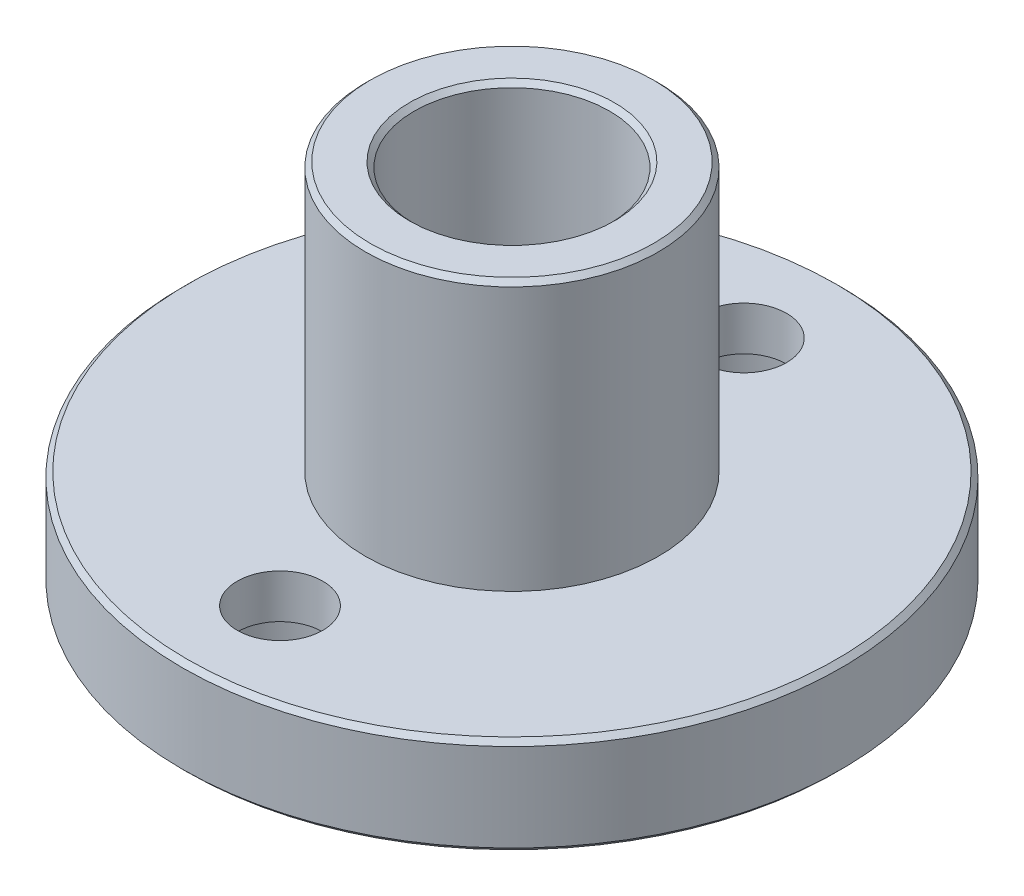
ISO-10303-21;
HEADER;
FILE_DESCRIPTION(('STEP AP214'),'2;1');
FILE_NAME('part.step','',(''),(''),'','','');
FILE_SCHEMA(('AUTOMOTIVE_DESIGN { 1 0 10303 214 1 1 1 1 }'));
ENDSEC;
DATA;
#1=APPLICATION_CONTEXT('core data for automotive mechanical design processes');
#2=APPLICATION_PROTOCOL_DEFINITION('international standard','automotive_design',2000,#1);
#3=PRODUCT_CONTEXT('',#1,'mechanical');
#4=PRODUCT('Part','Part','',(#3));
#5=PRODUCT_RELATED_PRODUCT_CATEGORY('part','',(#4));
#6=PRODUCT_DEFINITION_FORMATION('','',#4);
#7=PRODUCT_DEFINITION_CONTEXT('part definition',#1,'design');
#8=PRODUCT_DEFINITION('design','',#6,#7);
#9=PRODUCT_DEFINITION_SHAPE('','',#8);
#10=(LENGTH_UNIT() NAMED_UNIT(*) SI_UNIT(.MILLI.,.METRE.));
#11=(NAMED_UNIT(*) PLANE_ANGLE_UNIT() SI_UNIT($,.RADIAN.));
#12=(NAMED_UNIT(*) SI_UNIT($,.STERADIAN.) SOLID_ANGLE_UNIT());
#13=UNCERTAINTY_MEASURE_WITH_UNIT(LENGTH_MEASURE(1.E-05),#10,'distance_accuracy_value','');
#14=(GEOMETRIC_REPRESENTATION_CONTEXT(3) GLOBAL_UNCERTAINTY_ASSIGNED_CONTEXT((#13)) GLOBAL_UNIT_ASSIGNED_CONTEXT((#10,
#11,#12)) REPRESENTATION_CONTEXT('',''));
#15=CARTESIAN_POINT('',(0.,0.,0.));
#16=DIRECTION('',(0.,0.,1.));
#17=DIRECTION('',(1.,0.,0.));
#18=AXIS2_PLACEMENT_3D('',#15,#16,#17);
#19=CARTESIAN_POINT('',(0.,15.,9.5));
#20=DIRECTION('',(0.,-1.,0.));
#21=DIRECTION('',(0.,0.,-1.));
#22=AXIS2_PLACEMENT_3D('',#19,#20,#21);
#23=CYLINDRICAL_SURFACE('',#22,1.75);
#24=CARTESIAN_POINT('',(0.,4.,9.5));
#25=DIRECTION('',(0.,1.,0.));
#26=DIRECTION('',(0.,0.,1.));
#27=AXIS2_PLACEMENT_3D('',#24,#25,#26);
#28=CIRCLE('',#27,1.75);
#29=CARTESIAN_POINT('',(0.,4.,11.25));
#30=VERTEX_POINT('',#29);
#31=EDGE_CURVE('E77',#30,#30,#28,.T.);
#32=ORIENTED_EDGE('',*,*,#31,.T.);
#33=EDGE_LOOP('',(#32));
#34=FACE_BOUND('',#33,.T.);
#35=CARTESIAN_POINT('',(0.,2.2,9.5));
#36=DIRECTION('',(0.,-1.,0.));
#37=DIRECTION('',(0.,0.,-1.));
#38=AXIS2_PLACEMENT_3D('',#35,#36,#37);
#39=CIRCLE('',#38,1.75);
#40=CARTESIAN_POINT('',(0.,2.2,7.75));
#41=VERTEX_POINT('',#40);
#42=EDGE_CURVE('E74',#41,#41,#39,.F.);
#43=ORIENTED_EDGE('',*,*,#42,.F.);
#44=EDGE_LOOP('',(#43));
#45=FACE_BOUND('',#44,.T.);
#46=ADVANCED_FACE('F40',(#34,#45),#23,.F.);
#47=CARTESIAN_POINT('',(0.,15.,-9.5));
#48=DIRECTION('',(0.,-1.,0.));
#49=DIRECTION('',(0.,0.,-1.));
#50=AXIS2_PLACEMENT_3D('',#47,#48,#49);
#51=CYLINDRICAL_SURFACE('',#50,1.75);
#52=CARTESIAN_POINT('',(0.,4.,-9.5));
#53=DIRECTION('',(0.,1.,0.));
#54=DIRECTION('',(0.,0.,1.));
#55=AXIS2_PLACEMENT_3D('',#52,#53,#54);
#56=CIRCLE('',#55,1.75);
#57=CARTESIAN_POINT('',(0.,4.,-7.75));
#58=VERTEX_POINT('',#57);
#59=EDGE_CURVE('E87',#58,#58,#56,.T.);
#60=ORIENTED_EDGE('',*,*,#59,.T.);
#61=EDGE_LOOP('',(#60));
#62=FACE_BOUND('',#61,.T.);
#63=CARTESIAN_POINT('',(0.,2.2,-9.5));
#64=DIRECTION('',(0.,-1.,0.));
#65=DIRECTION('',(0.,0.,-1.));
#66=AXIS2_PLACEMENT_3D('',#63,#64,#65);
#67=CIRCLE('',#66,1.75);
#68=CARTESIAN_POINT('',(0.,2.2,-11.25));
#69=VERTEX_POINT('',#68);
#70=EDGE_CURVE('E78',#69,#69,#67,.F.);
#71=ORIENTED_EDGE('',*,*,#70,.F.);
#72=EDGE_LOOP('',(#71));
#73=FACE_BOUND('',#72,.T.);
#74=ADVANCED_FACE('F142',(#62,#73),#51,.F.);
#75=CARTESIAN_POINT('',(0.,4.,0.));
#76=DIRECTION('',(0.,-1.,0.));
#77=DIRECTION('',(0.,0.,-1.));
#78=AXIS2_PLACEMENT_3D('',#75,#76,#77);
#79=CYLINDRICAL_SURFACE('',#78,13.5);
#80=CARTESIAN_POINT('',(0.,3.8,0.));
#81=DIRECTION('',(0.,1.,0.));
#82=DIRECTION('',(0.,0.,1.));
#83=AXIS2_PLACEMENT_3D('',#80,#81,#82);
#84=CIRCLE('',#83,13.5);
#85=CARTESIAN_POINT('',(0.,3.8,13.5));
#86=VERTEX_POINT('',#85);
#87=EDGE_CURVE('E48',#86,#86,#84,.F.);
#88=ORIENTED_EDGE('',*,*,#87,.T.);
#89=EDGE_LOOP('',(#88));
#90=FACE_BOUND('',#89,.T.);
#91=CARTESIAN_POINT('',(0.,0.200000000000007,0.));
#92=DIRECTION('',(0.,1.,0.));
#93=DIRECTION('',(0.,0.,1.));
#94=AXIS2_PLACEMENT_3D('',#91,#92,#93);
#95=CIRCLE('',#94,13.5);
#96=CARTESIAN_POINT('',(0.,0.200000000000007,13.5));
#97=VERTEX_POINT('',#96);
#98=EDGE_CURVE('E52',#97,#97,#95,.T.);
#99=ORIENTED_EDGE('',*,*,#98,.T.);
#100=EDGE_LOOP('',(#99));
#101=FACE_BOUND('',#100,.T.);
#102=ADVANCED_FACE('F147',(#90,#101),#79,.T.);
#103=CARTESIAN_POINT('',(0.,4.,0.));
#104=DIRECTION('',(0.,1.,0.));
#105=DIRECTION('',(0.,0.,1.));
#106=AXIS2_PLACEMENT_3D('',#103,#104,#105);
#107=PLANE('',#106);
#108=CARTESIAN_POINT('',(0.,4.,0.));
#109=DIRECTION('',(0.,1.,0.));
#110=DIRECTION('',(0.,0.,1.));
#111=AXIS2_PLACEMENT_3D('',#108,#109,#110);
#112=CIRCLE('',#111,13.3);
#113=CARTESIAN_POINT('',(0.,4.,13.3));
#114=VERTEX_POINT('',#113);
#115=EDGE_CURVE('E56',#114,#114,#112,.T.);
#116=ORIENTED_EDGE('',*,*,#115,.T.);
#117=EDGE_LOOP('',(#116));
#118=FACE_BOUND('',#117,.T.);
#119=ORIENTED_EDGE('',*,*,#59,.F.);
#120=EDGE_LOOP('',(#119));
#121=FACE_BOUND('',#120,.T.);
#122=ORIENTED_EDGE('',*,*,#31,.F.);
#123=EDGE_LOOP('',(#122));
#124=FACE_BOUND('',#123,.T.);
#125=CARTESIAN_POINT('',(0.,4.,0.));
#126=DIRECTION('',(0.,1.,0.));
#127=DIRECTION('',(0.,0.,1.));
#128=AXIS2_PLACEMENT_3D('',#125,#126,#127);
#129=CIRCLE('',#128,6.);
#130=CARTESIAN_POINT('',(0.,4.,6.));
#131=VERTEX_POINT('',#130);
#132=EDGE_CURVE('E73',#131,#131,#129,.T.);
#133=ORIENTED_EDGE('',*,*,#132,.F.);
#134=EDGE_LOOP('',(#133));
#135=FACE_BOUND('',#134,.T.);
#136=ADVANCED_FACE('F118',(#118,#121,#124,#135),#107,.T.);
#137=CARTESIAN_POINT('',(0.,0.,0.));
#138=DIRECTION('',(0.,1.,0.));
#139=DIRECTION('',(0.,0.,1.));
#140=AXIS2_PLACEMENT_3D('',#137,#138,#139);
#141=PLANE('',#140);
#142=CARTESIAN_POINT('',(0.,0.,0.));
#143=DIRECTION('',(0.,1.,0.));
#144=DIRECTION('',(0.,0.,1.));
#145=AXIS2_PLACEMENT_3D('',#142,#143,#144);
#146=CIRCLE('',#145,13.3);
#147=CARTESIAN_POINT('',(0.,0.,13.3));
#148=VERTEX_POINT('',#147);
#149=EDGE_CURVE('E10',#148,#148,#146,.F.);
#150=ORIENTED_EDGE('',*,*,#149,.T.);
#151=EDGE_LOOP('',(#150));
#152=FACE_BOUND('',#151,.T.);
#153=CARTESIAN_POINT('',(0.,0.,9.5));
#154=DIRECTION('',(0.,-1.,0.));
#155=DIRECTION('',(0.,0.,-1.));
#156=AXIS2_PLACEMENT_3D('',#153,#154,#155);
#157=CIRCLE('',#156,3.);
#158=CARTESIAN_POINT('',(0.,0.,6.5));
#159=VERTEX_POINT('',#158);
#160=EDGE_CURVE('E98',#159,#159,#157,.T.);
#161=ORIENTED_EDGE('',*,*,#160,.F.);
#162=EDGE_LOOP('',(#161));
#163=FACE_BOUND('',#162,.T.);
#164=CARTESIAN_POINT('',(0.,0.,-9.5));
#165=DIRECTION('',(0.,-1.,0.));
#166=DIRECTION('',(0.,0.,-1.));
#167=AXIS2_PLACEMENT_3D('',#164,#165,#166);
#168=CIRCLE('',#167,3.);
#169=CARTESIAN_POINT('',(0.,0.,-12.5));
#170=VERTEX_POINT('',#169);
#171=EDGE_CURVE('E95',#170,#170,#168,.T.);
#172=ORIENTED_EDGE('',*,*,#171,.F.);
#173=EDGE_LOOP('',(#172));
#174=FACE_BOUND('',#173,.T.);
#175=CARTESIAN_POINT('',(0.,0.,0.));
#176=DIRECTION('',(0.,-1.,0.));
#177=DIRECTION('',(0.,0.,-1.));
#178=AXIS2_PLACEMENT_3D('',#175,#176,#177);
#179=CIRCLE('',#178,4.);
#180=CARTESIAN_POINT('',(0.,0.,-4.));
#181=VERTEX_POINT('',#180);
#182=EDGE_CURVE('E84',#181,#181,#179,.T.);
#183=ORIENTED_EDGE('',*,*,#182,.F.);
#184=EDGE_LOOP('',(#183));
#185=FACE_BOUND('',#184,.T.);
#186=ADVANCED_FACE('F114',(#152,#163,#174,#185),#141,.F.);
#187=CARTESIAN_POINT('',(0.,15.,0.));
#188=DIRECTION('',(0.,-1.,0.));
#189=DIRECTION('',(0.,0.,-1.));
#190=AXIS2_PLACEMENT_3D('',#187,#188,#189);
#191=CYLINDRICAL_SURFACE('',#190,6.);
#192=CARTESIAN_POINT('',(0.,14.8,0.));
#193=DIRECTION('',(0.,1.,0.));
#194=DIRECTION('',(0.,0.,1.));
#195=AXIS2_PLACEMENT_3D('',#192,#193,#194);
#196=CIRCLE('',#195,6.);
#197=CARTESIAN_POINT('',(0.,14.8,6.));
#198=VERTEX_POINT('',#197);
#199=EDGE_CURVE('E61',#198,#198,#196,.F.);
#200=ORIENTED_EDGE('',*,*,#199,.T.);
#201=EDGE_LOOP('',(#200));
#202=FACE_BOUND('',#201,.T.);
#203=ORIENTED_EDGE('',*,*,#132,.T.);
#204=EDGE_LOOP('',(#203));
#205=FACE_BOUND('',#204,.T.);
#206=ADVANCED_FACE('F117',(#202,#205),#191,.T.);
#207=CARTESIAN_POINT('',(0.,15.,0.));
#208=DIRECTION('',(0.,1.,0.));
#209=DIRECTION('',(0.,0.,1.));
#210=AXIS2_PLACEMENT_3D('',#207,#208,#209);
#211=PLANE('',#210);
#212=CARTESIAN_POINT('',(0.,15.,0.));
#213=DIRECTION('',(0.,1.,0.));
#214=DIRECTION('',(0.,0.,1.));
#215=AXIS2_PLACEMENT_3D('',#212,#213,#214);
#216=CIRCLE('',#215,4.2);
#217=CARTESIAN_POINT('',(0.,15.,4.2));
#218=VERTEX_POINT('',#217);
#219=EDGE_CURVE('E67',#218,#218,#216,.F.);
#220=ORIENTED_EDGE('',*,*,#219,.T.);
#221=EDGE_LOOP('',(#220));
#222=FACE_BOUND('',#221,.T.);
#223=CARTESIAN_POINT('',(0.,15.,0.));
#224=DIRECTION('',(0.,1.,0.));
#225=DIRECTION('',(0.,0.,1.));
#226=AXIS2_PLACEMENT_3D('',#223,#224,#225);
#227=CIRCLE('',#226,5.80000000000001);
#228=CARTESIAN_POINT('',(0.,15.,5.80000000000001));
#229=VERTEX_POINT('',#228);
#230=EDGE_CURVE('E70',#229,#229,#227,.T.);
#231=ORIENTED_EDGE('',*,*,#230,.T.);
#232=EDGE_LOOP('',(#231));
#233=FACE_BOUND('',#232,.T.);
#234=ADVANCED_FACE('F127',(#222,#233),#211,.T.);
#235=CARTESIAN_POINT('',(0.,15.,0.));
#236=DIRECTION('',(0.,-1.,0.));
#237=DIRECTION('',(0.,0.,-1.));
#238=AXIS2_PLACEMENT_3D('',#235,#236,#237);
#239=CYLINDRICAL_SURFACE('',#238,4.);
#240=CARTESIAN_POINT('',(0.,14.8,0.));
#241=DIRECTION('',(0.,1.,0.));
#242=DIRECTION('',(0.,0.,1.));
#243=AXIS2_PLACEMENT_3D('',#240,#241,#242);
#244=CIRCLE('',#243,4.);
#245=CARTESIAN_POINT('',(0.,14.8,4.));
#246=VERTEX_POINT('',#245);
#247=EDGE_CURVE('E64',#246,#246,#244,.T.);
#248=ORIENTED_EDGE('',*,*,#247,.T.);
#249=EDGE_LOOP('',(#248));
#250=FACE_BOUND('',#249,.T.);
#251=ORIENTED_EDGE('',*,*,#182,.T.);
#252=EDGE_LOOP('',(#251));
#253=FACE_BOUND('',#252,.T.);
#254=ADVANCED_FACE('F124',(#250,#253),#239,.F.);
#255=CARTESIAN_POINT('',(0.,2.2,-9.5));
#256=DIRECTION('',(0.,-1.,0.));
#257=DIRECTION('',(0.,0.,-1.));
#258=AXIS2_PLACEMENT_3D('',#255,#256,#257);
#259=PLANE('',#258);
#260=CARTESIAN_POINT('',(0.,2.2,-9.5));
#261=DIRECTION('',(0.,-1.,0.));
#262=DIRECTION('',(0.,0.,-1.));
#263=AXIS2_PLACEMENT_3D('',#260,#261,#262);
#264=CIRCLE('',#263,3.);
#265=CARTESIAN_POINT('',(0.,2.2,-12.5));
#266=VERTEX_POINT('',#265);
#267=EDGE_CURVE('E92',#266,#266,#264,.T.);
#268=ORIENTED_EDGE('',*,*,#267,.T.);
#269=EDGE_LOOP('',(#268));
#270=FACE_BOUND('',#269,.T.);
#271=ORIENTED_EDGE('',*,*,#70,.T.);
#272=EDGE_LOOP('',(#271));
#273=FACE_BOUND('',#272,.T.);
#274=ADVANCED_FACE('F126',(#270,#273),#259,.T.);
#275=CARTESIAN_POINT('',(0.,2.2,-9.5));
#276=DIRECTION('',(0.,-1.,0.));
#277=DIRECTION('',(0.,0.,-1.));
#278=AXIS2_PLACEMENT_3D('',#275,#276,#277);
#279=CYLINDRICAL_SURFACE('',#278,3.);
#280=ORIENTED_EDGE('',*,*,#267,.F.);
#281=EDGE_LOOP('',(#280));
#282=FACE_BOUND('',#281,.T.);
#283=ORIENTED_EDGE('',*,*,#171,.T.);
#284=EDGE_LOOP('',(#283));
#285=FACE_BOUND('',#284,.T.);
#286=ADVANCED_FACE('F135',(#282,#285),#279,.F.);
#287=CARTESIAN_POINT('',(0.,2.2,9.5));
#288=DIRECTION('',(0.,-1.,0.));
#289=DIRECTION('',(0.,0.,-1.));
#290=AXIS2_PLACEMENT_3D('',#287,#288,#289);
#291=PLANE('',#290);
#292=CARTESIAN_POINT('',(0.,2.2,9.5));
#293=DIRECTION('',(0.,-1.,0.));
#294=DIRECTION('',(0.,0.,-1.));
#295=AXIS2_PLACEMENT_3D('',#292,#293,#294);
#296=CIRCLE('',#295,3.);
#297=CARTESIAN_POINT('',(0.,2.2,6.5));
#298=VERTEX_POINT('',#297);
#299=EDGE_CURVE('E81',#298,#298,#296,.T.);
#300=ORIENTED_EDGE('',*,*,#299,.T.);
#301=EDGE_LOOP('',(#300));
#302=FACE_BOUND('',#301,.T.);
#303=ORIENTED_EDGE('',*,*,#42,.T.);
#304=EDGE_LOOP('',(#303));
#305=FACE_BOUND('',#304,.T.);
#306=ADVANCED_FACE('F104',(#302,#305),#291,.T.);
#307=CARTESIAN_POINT('',(0.,2.2,9.5));
#308=DIRECTION('',(0.,-1.,0.));
#309=DIRECTION('',(0.,0.,-1.));
#310=AXIS2_PLACEMENT_3D('',#307,#308,#309);
#311=CYLINDRICAL_SURFACE('',#310,3.);
#312=ORIENTED_EDGE('',*,*,#299,.F.);
#313=EDGE_LOOP('',(#312));
#314=FACE_BOUND('',#313,.T.);
#315=ORIENTED_EDGE('',*,*,#160,.T.);
#316=EDGE_LOOP('',(#315));
#317=FACE_BOUND('',#316,.T.);
#318=ADVANCED_FACE('F107',(#314,#317),#311,.F.);
#319=CARTESIAN_POINT('',(0.,15.,0.));
#320=DIRECTION('',(0.,1.,0.));
#321=DIRECTION('',(0.,0.,1.));
#322=AXIS2_PLACEMENT_3D('',#319,#320,#321);
#323=CONICAL_SURFACE('',#322,4.2,0.78539816339744);
#324=ORIENTED_EDGE('',*,*,#247,.F.);
#325=EDGE_LOOP('',(#324));
#326=FACE_BOUND('',#325,.T.);
#327=ORIENTED_EDGE('',*,*,#219,.F.);
#328=EDGE_LOOP('',(#327));
#329=FACE_BOUND('',#328,.T.);
#330=ADVANCED_FACE('F110',(#326,#329),#323,.F.);
#331=CARTESIAN_POINT('',(0.,15.,0.));
#332=DIRECTION('',(0.,-1.,0.));
#333=DIRECTION('',(0.,0.,-1.));
#334=AXIS2_PLACEMENT_3D('',#331,#332,#333);
#335=CONICAL_SURFACE('',#334,5.80000000000001,0.78539816339744);
#336=ORIENTED_EDGE('',*,*,#199,.F.);
#337=EDGE_LOOP('',(#336));
#338=FACE_BOUND('',#337,.T.);
#339=ORIENTED_EDGE('',*,*,#230,.F.);
#340=EDGE_LOOP('',(#339));
#341=FACE_BOUND('',#340,.T.);
#342=ADVANCED_FACE('F231',(#338,#341),#335,.T.);
#343=CARTESIAN_POINT('',(0.,4.,0.));
#344=DIRECTION('',(0.,-1.,0.));
#345=DIRECTION('',(0.,0.,-1.));
#346=AXIS2_PLACEMENT_3D('',#343,#344,#345);
#347=CONICAL_SURFACE('',#346,13.3,0.785398163397453);
#348=ORIENTED_EDGE('',*,*,#87,.F.);
#349=EDGE_LOOP('',(#348));
#350=FACE_BOUND('',#349,.T.);
#351=ORIENTED_EDGE('',*,*,#115,.F.);
#352=EDGE_LOOP('',(#351));
#353=FACE_BOUND('',#352,.T.);
#354=ADVANCED_FACE('F240',(#350,#353),#347,.T.);
#355=CARTESIAN_POINT('',(0.,0.200000000000007,0.));
#356=DIRECTION('',(0.,1.,0.));
#357=DIRECTION('',(0.,0.,1.));
#358=AXIS2_PLACEMENT_3D('',#355,#356,#357);
#359=CONICAL_SURFACE('',#358,13.5,0.785398163397453);
#360=ORIENTED_EDGE('',*,*,#149,.F.);
#361=EDGE_LOOP('',(#360));
#362=FACE_BOUND('',#361,.T.);
#363=ORIENTED_EDGE('',*,*,#98,.F.);
#364=EDGE_LOOP('',(#363));
#365=FACE_BOUND('',#364,.T.);
#366=ADVANCED_FACE('F43',(#362,#365),#359,.T.);
#367=CLOSED_SHELL('',(#46,#74,#102,#136,#186,#206,#234,#254,#274,#286,#306,#318,#330,#342,#354,#366));
#368=MANIFOLD_SOLID_BREP('B2',#367);
#369=ADVANCED_BREP_SHAPE_REPRESENTATION('',(#18,#368),#14);
#370=SHAPE_DEFINITION_REPRESENTATION(#9,#369);
ENDSEC;
END-ISO-10303-21;
